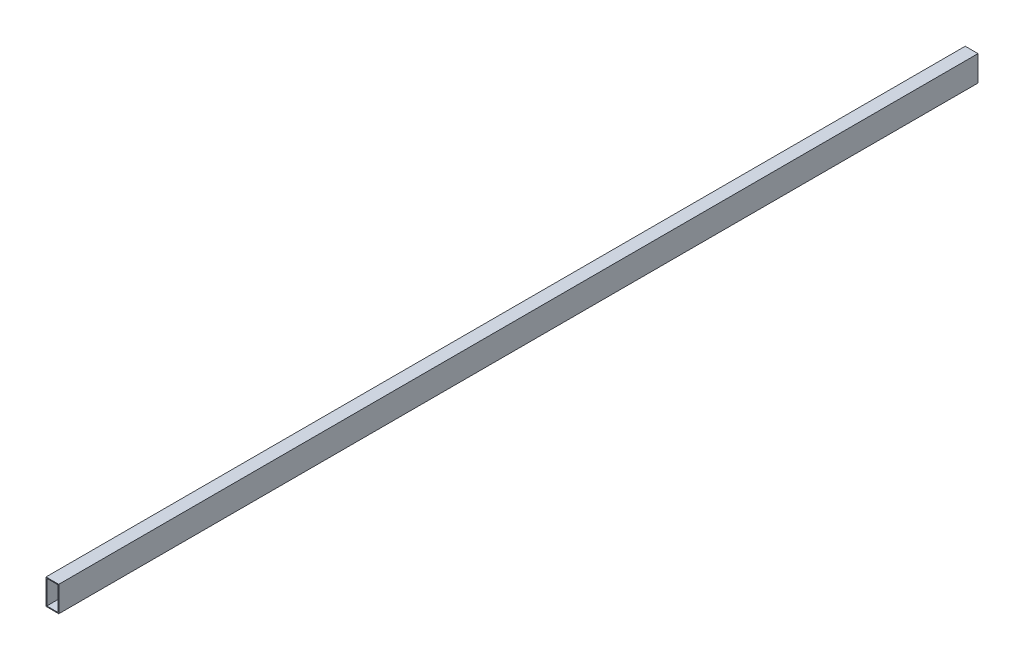
ISO-10303-21;
HEADER;
FILE_DESCRIPTION(('STEP AP214'),'2;1');
FILE_NAME('part.step','',(''),(''),'','','');
FILE_SCHEMA(('AUTOMOTIVE_DESIGN { 1 0 10303 214 1 1 1 1 }'));
ENDSEC;
DATA;
#1=APPLICATION_CONTEXT('core data for automotive mechanical design processes');
#2=APPLICATION_PROTOCOL_DEFINITION('international standard','automotive_design',2000,#1);
#3=PRODUCT_CONTEXT('',#1,'mechanical');
#4=PRODUCT('Part','Part','',(#3));
#5=PRODUCT_RELATED_PRODUCT_CATEGORY('part','',(#4));
#6=PRODUCT_DEFINITION_FORMATION('','',#4);
#7=PRODUCT_DEFINITION_CONTEXT('part definition',#1,'design');
#8=PRODUCT_DEFINITION('design','',#6,#7);
#9=PRODUCT_DEFINITION_SHAPE('','',#8);
#10=(LENGTH_UNIT() NAMED_UNIT(*) SI_UNIT(.MILLI.,.METRE.));
#11=(NAMED_UNIT(*) PLANE_ANGLE_UNIT() SI_UNIT($,.RADIAN.));
#12=(NAMED_UNIT(*) SI_UNIT($,.STERADIAN.) SOLID_ANGLE_UNIT());
#13=UNCERTAINTY_MEASURE_WITH_UNIT(LENGTH_MEASURE(1.E-05),#10,'distance_accuracy_value','');
#14=(GEOMETRIC_REPRESENTATION_CONTEXT(3) GLOBAL_UNCERTAINTY_ASSIGNED_CONTEXT((#13)) GLOBAL_UNIT_ASSIGNED_CONTEXT((#10,
#11,#12)) REPRESENTATION_CONTEXT('',''));
#15=CARTESIAN_POINT('',(0.,0.,0.));
#16=DIRECTION('',(0.,0.,1.));
#17=DIRECTION('',(1.,0.,0.));
#18=AXIS2_PLACEMENT_3D('',#15,#16,#17);
#19=CARTESIAN_POINT('',(0.,0.,1828.8));
#20=DIRECTION('',(0.,0.,-1.));
#21=DIRECTION('',(-1.,0.,0.));
#22=AXIS2_PLACEMENT_3D('',#19,#20,#21);
#23=PLANE('',#22);
#24=DIRECTION('',(0.,1.,0.));
#25=VECTOR('',#24,1.);
#26=CARTESIAN_POINT('',(12.7,-25.4,1828.8));
#27=LINE('',#26,#25);
#28=CARTESIAN_POINT('',(12.7,-25.4,1828.8));
#29=VERTEX_POINT('',#28);
#30=CARTESIAN_POINT('',(12.7,25.4,1828.8));
#31=VERTEX_POINT('',#30);
#32=EDGE_CURVE('E134',#29,#31,#27,.T.);
#33=ORIENTED_EDGE('',*,*,#32,.T.);
#34=DIRECTION('',(-1.,0.,0.));
#35=VECTOR('',#34,1.);
#36=CARTESIAN_POINT('',(-12.7,25.4,1828.8));
#37=LINE('',#36,#35);
#38=CARTESIAN_POINT('',(-12.7,25.4,1828.8));
#39=VERTEX_POINT('',#38);
#40=EDGE_CURVE('E137',#31,#39,#37,.T.);
#41=ORIENTED_EDGE('',*,*,#40,.T.);
#42=DIRECTION('',(0.,-1.,0.));
#43=VECTOR('',#42,1.);
#44=CARTESIAN_POINT('',(-12.7,-25.4,1828.8));
#45=LINE('',#44,#43);
#46=CARTESIAN_POINT('',(-12.7,-25.4,1828.8));
#47=VERTEX_POINT('',#46);
#48=EDGE_CURVE('E140',#39,#47,#45,.T.);
#49=ORIENTED_EDGE('',*,*,#48,.T.);
#50=DIRECTION('',(1.,0.,0.));
#51=VECTOR('',#50,1.);
#52=CARTESIAN_POINT('',(-12.7,-25.4,1828.8));
#53=LINE('',#52,#51);
#54=EDGE_CURVE('E142',#47,#29,#53,.T.);
#55=ORIENTED_EDGE('',*,*,#54,.T.);
#56=EDGE_LOOP('',(#33,#41,#49,#55));
#57=FACE_BOUND('',#56,.T.);
#58=DIRECTION('',(0.,1.,0.));
#59=VECTOR('',#58,1.);
#60=CARTESIAN_POINT('',(11.1252,-23.8252,1828.8));
#61=LINE('',#60,#59);
#62=CARTESIAN_POINT('',(11.1252,-23.8252,1828.8));
#63=VERTEX_POINT('',#62);
#64=CARTESIAN_POINT('',(11.1252,23.8252,1828.8));
#65=VERTEX_POINT('',#64);
#66=EDGE_CURVE('E98',#63,#65,#61,.T.);
#67=ORIENTED_EDGE('',*,*,#66,.F.);
#68=DIRECTION('',(1.,0.,0.));
#69=VECTOR('',#68,1.);
#70=CARTESIAN_POINT('',(-11.1252,-23.8252,1828.8));
#71=LINE('',#70,#69);
#72=CARTESIAN_POINT('',(-11.1252,-23.8252,1828.8));
#73=VERTEX_POINT('',#72);
#74=EDGE_CURVE('E120',#73,#63,#71,.T.);
#75=ORIENTED_EDGE('',*,*,#74,.F.);
#76=DIRECTION('',(0.,-1.,0.));
#77=VECTOR('',#76,1.);
#78=CARTESIAN_POINT('',(-11.1252,-23.8252,1828.8));
#79=LINE('',#78,#77);
#80=CARTESIAN_POINT('',(-11.1252,23.8252,1828.8));
#81=VERTEX_POINT('',#80);
#82=EDGE_CURVE('E118',#81,#73,#79,.T.);
#83=ORIENTED_EDGE('',*,*,#82,.F.);
#84=DIRECTION('',(-1.,0.,0.));
#85=VECTOR('',#84,1.);
#86=CARTESIAN_POINT('',(-11.1252,23.8252,1828.8));
#87=LINE('',#86,#85);
#88=EDGE_CURVE('E106',#65,#81,#87,.T.);
#89=ORIENTED_EDGE('',*,*,#88,.F.);
#90=EDGE_LOOP('',(#67,#75,#83,#89));
#91=FACE_BOUND('',#90,.T.);
#92=ADVANCED_FACE('F33',(#57,#91),#23,.F.);
#93=CARTESIAN_POINT('',(0.,0.,0.));
#94=DIRECTION('',(0.,0.,-1.));
#95=DIRECTION('',(-1.,0.,0.));
#96=AXIS2_PLACEMENT_3D('',#93,#94,#95);
#97=PLANE('',#96);
#98=DIRECTION('',(0.,1.,0.));
#99=VECTOR('',#98,1.);
#100=CARTESIAN_POINT('',(12.7,-25.4,0.));
#101=LINE('',#100,#99);
#102=CARTESIAN_POINT('',(12.7,-25.4,0.));
#103=VERTEX_POINT('',#102);
#104=CARTESIAN_POINT('',(12.7,25.4,0.));
#105=VERTEX_POINT('',#104);
#106=EDGE_CURVE('E114',#103,#105,#101,.T.);
#107=ORIENTED_EDGE('',*,*,#106,.F.);
#108=DIRECTION('',(1.,0.,0.));
#109=VECTOR('',#108,1.);
#110=CARTESIAN_POINT('',(-12.7,-25.4,0.));
#111=LINE('',#110,#109);
#112=CARTESIAN_POINT('',(-12.7,-25.4,0.));
#113=VERTEX_POINT('',#112);
#114=EDGE_CURVE('E138',#113,#103,#111,.T.);
#115=ORIENTED_EDGE('',*,*,#114,.F.);
#116=DIRECTION('',(0.,-1.,0.));
#117=VECTOR('',#116,1.);
#118=CARTESIAN_POINT('',(-12.7,-25.4,0.));
#119=LINE('',#118,#117);
#120=CARTESIAN_POINT('',(-12.7,25.4,0.));
#121=VERTEX_POINT('',#120);
#122=EDGE_CURVE('E149',#121,#113,#119,.T.);
#123=ORIENTED_EDGE('',*,*,#122,.F.);
#124=DIRECTION('',(-1.,0.,0.));
#125=VECTOR('',#124,1.);
#126=CARTESIAN_POINT('',(-12.7,25.4,0.));
#127=LINE('',#126,#125);
#128=EDGE_CURVE('E147',#105,#121,#127,.T.);
#129=ORIENTED_EDGE('',*,*,#128,.F.);
#130=EDGE_LOOP('',(#107,#115,#123,#129));
#131=FACE_BOUND('',#130,.T.);
#132=DIRECTION('',(1.,0.,0.));
#133=VECTOR('',#132,1.);
#134=CARTESIAN_POINT('',(-11.1252,-23.8252,0.));
#135=LINE('',#134,#133);
#136=CARTESIAN_POINT('',(-11.1252,-23.8252,0.));
#137=VERTEX_POINT('',#136);
#138=CARTESIAN_POINT('',(11.1252,-23.8252,0.));
#139=VERTEX_POINT('',#138);
#140=EDGE_CURVE('E107',#137,#139,#135,.T.);
#141=ORIENTED_EDGE('',*,*,#140,.T.);
#142=DIRECTION('',(0.,1.,0.));
#143=VECTOR('',#142,1.);
#144=CARTESIAN_POINT('',(11.1252,-23.8252,0.));
#145=LINE('',#144,#143);
#146=CARTESIAN_POINT('',(11.1252,23.8252,0.));
#147=VERTEX_POINT('',#146);
#148=EDGE_CURVE('E56',#139,#147,#145,.T.);
#149=ORIENTED_EDGE('',*,*,#148,.T.);
#150=DIRECTION('',(-1.,0.,0.));
#151=VECTOR('',#150,1.);
#152=CARTESIAN_POINT('',(-11.1252,23.8252,0.));
#153=LINE('',#152,#151);
#154=CARTESIAN_POINT('',(-11.1252,23.8252,0.));
#155=VERTEX_POINT('',#154);
#156=EDGE_CURVE('E113',#147,#155,#153,.T.);
#157=ORIENTED_EDGE('',*,*,#156,.T.);
#158=DIRECTION('',(0.,-1.,0.));
#159=VECTOR('',#158,1.);
#160=CARTESIAN_POINT('',(-11.1252,-23.8252,0.));
#161=LINE('',#160,#159);
#162=EDGE_CURVE('E126',#155,#137,#161,.T.);
#163=ORIENTED_EDGE('',*,*,#162,.T.);
#164=EDGE_LOOP('',(#141,#149,#157,#163));
#165=FACE_BOUND('',#164,.T.);
#166=ADVANCED_FACE('F167',(#131,#165),#97,.T.);
#167=CARTESIAN_POINT('',(12.7,-25.4,1828.8));
#168=DIRECTION('',(-1.,0.,0.));
#169=DIRECTION('',(0.,0.,1.));
#170=AXIS2_PLACEMENT_3D('',#167,#168,#169);
#171=PLANE('',#170);
#172=ORIENTED_EDGE('',*,*,#106,.T.);
#173=DIRECTION('',(0.,0.,-1.));
#174=VECTOR('',#173,1.);
#175=CARTESIAN_POINT('',(12.7,25.4,1828.8));
#176=LINE('',#175,#174);
#177=EDGE_CURVE('E11',#31,#105,#176,.T.);
#178=ORIENTED_EDGE('',*,*,#177,.F.);
#179=ORIENTED_EDGE('',*,*,#32,.F.);
#180=DIRECTION('',(0.,0.,-1.));
#181=VECTOR('',#180,1.);
#182=CARTESIAN_POINT('',(12.7,-25.4,1828.8));
#183=LINE('',#182,#181);
#184=EDGE_CURVE('E144',#29,#103,#183,.T.);
#185=ORIENTED_EDGE('',*,*,#184,.T.);
#186=EDGE_LOOP('',(#172,#178,#179,#185));
#187=FACE_BOUND('',#186,.T.);
#188=ADVANCED_FACE('F35',(#187),#171,.F.);
#189=CARTESIAN_POINT('',(-12.7,25.4,1828.8));
#190=DIRECTION('',(0.,-1.,0.));
#191=DIRECTION('',(0.,0.,-1.));
#192=AXIS2_PLACEMENT_3D('',#189,#190,#191);
#193=PLANE('',#192);
#194=ORIENTED_EDGE('',*,*,#128,.T.);
#195=DIRECTION('',(0.,0.,-1.));
#196=VECTOR('',#195,1.);
#197=CARTESIAN_POINT('',(-12.7,25.4,1828.8));
#198=LINE('',#197,#196);
#199=EDGE_CURVE('E41',#39,#121,#198,.T.);
#200=ORIENTED_EDGE('',*,*,#199,.F.);
#201=ORIENTED_EDGE('',*,*,#40,.F.);
#202=ORIENTED_EDGE('',*,*,#177,.T.);
#203=EDGE_LOOP('',(#194,#200,#201,#202));
#204=FACE_BOUND('',#203,.T.);
#205=ADVANCED_FACE('F177',(#204),#193,.F.);
#206=CARTESIAN_POINT('',(-12.7,-25.4,1828.8));
#207=DIRECTION('',(1.,0.,0.));
#208=DIRECTION('',(0.,0.,-1.));
#209=AXIS2_PLACEMENT_3D('',#206,#207,#208);
#210=PLANE('',#209);
#211=ORIENTED_EDGE('',*,*,#122,.T.);
#212=DIRECTION('',(0.,0.,-1.));
#213=VECTOR('',#212,1.);
#214=CARTESIAN_POINT('',(-12.7,-25.4,1828.8));
#215=LINE('',#214,#213);
#216=EDGE_CURVE('E154',#47,#113,#215,.T.);
#217=ORIENTED_EDGE('',*,*,#216,.F.);
#218=ORIENTED_EDGE('',*,*,#48,.F.);
#219=ORIENTED_EDGE('',*,*,#199,.T.);
#220=EDGE_LOOP('',(#211,#217,#218,#219));
#221=FACE_BOUND('',#220,.T.);
#222=ADVANCED_FACE('F161',(#221),#210,.F.);
#223=CARTESIAN_POINT('',(-12.7,-25.4,1828.8));
#224=DIRECTION('',(0.,1.,0.));
#225=DIRECTION('',(0.,0.,1.));
#226=AXIS2_PLACEMENT_3D('',#223,#224,#225);
#227=PLANE('',#226);
#228=ORIENTED_EDGE('',*,*,#114,.T.);
#229=ORIENTED_EDGE('',*,*,#184,.F.);
#230=ORIENTED_EDGE('',*,*,#54,.F.);
#231=ORIENTED_EDGE('',*,*,#216,.T.);
#232=EDGE_LOOP('',(#228,#229,#230,#231));
#233=FACE_BOUND('',#232,.T.);
#234=ADVANCED_FACE('F171',(#233),#227,.F.);
#235=CARTESIAN_POINT('',(11.1252,-23.8252,1828.8));
#236=DIRECTION('',(-1.,0.,0.));
#237=DIRECTION('',(0.,-1.,0.));
#238=AXIS2_PLACEMENT_3D('',#235,#236,#237);
#239=PLANE('',#238);
#240=ORIENTED_EDGE('',*,*,#148,.F.);
#241=DIRECTION('',(0.,0.,-1.));
#242=VECTOR('',#241,1.);
#243=CARTESIAN_POINT('',(11.1252,-23.8252,1828.8));
#244=LINE('',#243,#242);
#245=EDGE_CURVE('E102',#63,#139,#244,.T.);
#246=ORIENTED_EDGE('',*,*,#245,.F.);
#247=ORIENTED_EDGE('',*,*,#66,.T.);
#248=DIRECTION('',(0.,0.,-1.));
#249=VECTOR('',#248,1.);
#250=CARTESIAN_POINT('',(11.1252,23.8252,1828.8));
#251=LINE('',#250,#249);
#252=EDGE_CURVE('E101',#65,#147,#251,.T.);
#253=ORIENTED_EDGE('',*,*,#252,.T.);
#254=EDGE_LOOP('',(#240,#246,#247,#253));
#255=FACE_BOUND('',#254,.T.);
#256=ADVANCED_FACE('F100',(#255),#239,.T.);
#257=CARTESIAN_POINT('',(-11.1252,23.8252,1828.8));
#258=DIRECTION('',(0.,-1.,0.));
#259=DIRECTION('',(0.,0.,-1.));
#260=AXIS2_PLACEMENT_3D('',#257,#258,#259);
#261=PLANE('',#260);
#262=ORIENTED_EDGE('',*,*,#156,.F.);
#263=ORIENTED_EDGE('',*,*,#252,.F.);
#264=ORIENTED_EDGE('',*,*,#88,.T.);
#265=DIRECTION('',(0.,0.,-1.));
#266=VECTOR('',#265,1.);
#267=CARTESIAN_POINT('',(-11.1252,23.8252,1828.8));
#268=LINE('',#267,#266);
#269=EDGE_CURVE('E115',#81,#155,#268,.T.);
#270=ORIENTED_EDGE('',*,*,#269,.T.);
#271=EDGE_LOOP('',(#262,#263,#264,#270));
#272=FACE_BOUND('',#271,.T.);
#273=ADVANCED_FACE('F110',(#272),#261,.T.);
#274=CARTESIAN_POINT('',(-11.1252,-23.8252,1828.8));
#275=DIRECTION('',(1.,0.,0.));
#276=DIRECTION('',(0.,1.,0.));
#277=AXIS2_PLACEMENT_3D('',#274,#275,#276);
#278=PLANE('',#277);
#279=ORIENTED_EDGE('',*,*,#162,.F.);
#280=ORIENTED_EDGE('',*,*,#269,.F.);
#281=ORIENTED_EDGE('',*,*,#82,.T.);
#282=DIRECTION('',(0.,0.,-1.));
#283=VECTOR('',#282,1.);
#284=CARTESIAN_POINT('',(-11.1252,-23.8252,1828.8));
#285=LINE('',#284,#283);
#286=EDGE_CURVE('E48',#73,#137,#285,.T.);
#287=ORIENTED_EDGE('',*,*,#286,.T.);
#288=EDGE_LOOP('',(#279,#280,#281,#287));
#289=FACE_BOUND('',#288,.T.);
#290=ADVANCED_FACE('F200',(#289),#278,.T.);
#291=CARTESIAN_POINT('',(-11.1252,-23.8252,1828.8));
#292=DIRECTION('',(0.,1.,0.));
#293=DIRECTION('',(0.,0.,1.));
#294=AXIS2_PLACEMENT_3D('',#291,#292,#293);
#295=PLANE('',#294);
#296=ORIENTED_EDGE('',*,*,#140,.F.);
#297=ORIENTED_EDGE('',*,*,#286,.F.);
#298=ORIENTED_EDGE('',*,*,#74,.T.);
#299=ORIENTED_EDGE('',*,*,#245,.T.);
#300=EDGE_LOOP('',(#296,#297,#298,#299));
#301=FACE_BOUND('',#300,.T.);
#302=ADVANCED_FACE('F204',(#301),#295,.T.);
#303=CLOSED_SHELL('',(#92,#166,#188,#205,#222,#234,#256,#273,#290,#302));
#304=MANIFOLD_SOLID_BREP('B2',#303);
#305=ADVANCED_BREP_SHAPE_REPRESENTATION('',(#18,#304),#14);
#306=SHAPE_DEFINITION_REPRESENTATION(#9,#305);
ENDSEC;
END-ISO-10303-21;
